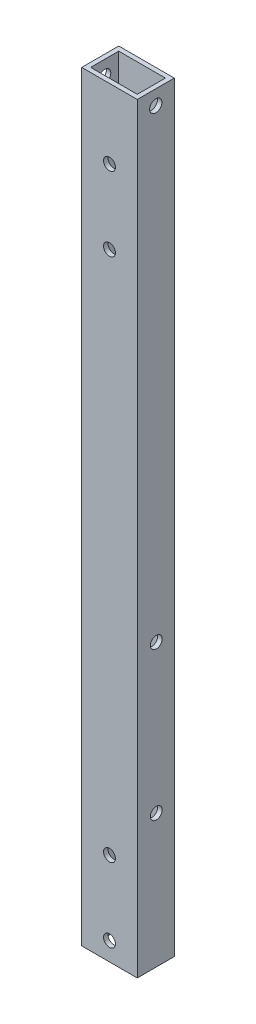
ISO-10303-21;
HEADER;
FILE_DESCRIPTION(('STEP AP214'),'2;1');
FILE_NAME('part.step','',(''),(''),'','','');
FILE_SCHEMA(('AUTOMOTIVE_DESIGN { 1 0 10303 214 1 1 1 1 }'));
ENDSEC;
DATA;
#1=APPLICATION_CONTEXT('core data for automotive mechanical design processes');
#2=APPLICATION_PROTOCOL_DEFINITION('international standard','automotive_design',2000,#1);
#3=PRODUCT_CONTEXT('',#1,'mechanical');
#4=PRODUCT('Part','Part','',(#3));
#5=PRODUCT_RELATED_PRODUCT_CATEGORY('part','',(#4));
#6=PRODUCT_DEFINITION_FORMATION('','',#4);
#7=PRODUCT_DEFINITION_CONTEXT('part definition',#1,'design');
#8=PRODUCT_DEFINITION('design','',#6,#7);
#9=PRODUCT_DEFINITION_SHAPE('','',#8);
#10=(LENGTH_UNIT() NAMED_UNIT(*) SI_UNIT(.MILLI.,.METRE.));
#11=(NAMED_UNIT(*) PLANE_ANGLE_UNIT() SI_UNIT($,.RADIAN.));
#12=(NAMED_UNIT(*) SI_UNIT($,.STERADIAN.) SOLID_ANGLE_UNIT());
#13=UNCERTAINTY_MEASURE_WITH_UNIT(LENGTH_MEASURE(1.E-05),#10,'distance_accuracy_value','');
#14=(GEOMETRIC_REPRESENTATION_CONTEXT(3) GLOBAL_UNCERTAINTY_ASSIGNED_CONTEXT((#13)) GLOBAL_UNIT_ASSIGNED_CONTEXT((#10,
#11,#12)) REPRESENTATION_CONTEXT('',''));
#15=CARTESIAN_POINT('',(0.,0.,0.));
#16=DIRECTION('',(0.,0.,1.));
#17=DIRECTION('',(1.,0.,0.));
#18=AXIS2_PLACEMENT_3D('',#15,#16,#17);
#19=CARTESIAN_POINT('',(7.5,110.,-5.));
#20=DIRECTION('',(-1.,0.,0.));
#21=DIRECTION('',(0.,0.,1.));
#22=AXIS2_PLACEMENT_3D('',#19,#20,#21);
#23=PLANE('',#22);
#24=CARTESIAN_POINT('',(7.5,91.5,0.));
#25=DIRECTION('',(-1.,0.,0.));
#26=DIRECTION('',(0.,0.,1.));
#27=AXIS2_PLACEMENT_3D('',#24,#25,#26);
#28=CIRCLE('',#27,1.65);
#29=CARTESIAN_POINT('',(7.5,91.5,1.64999999999995));
#30=VERTEX_POINT('',#29);
#31=EDGE_CURVE('E323',#30,#30,#28,.T.);
#32=ORIENTED_EDGE('',*,*,#31,.T.);
#33=EDGE_LOOP('',(#32));
#34=FACE_BOUND('',#33,.T.);
#35=CARTESIAN_POINT('',(7.5,-34.0000000000001,-0.125000000000044));
#36=DIRECTION('',(-1.,0.,0.));
#37=DIRECTION('',(0.,0.,1.));
#38=AXIS2_PLACEMENT_3D('',#35,#36,#37);
#39=CIRCLE('',#38,1.6);
#40=CARTESIAN_POINT('',(7.5,-34.0000000000001,1.47499999999995));
#41=VERTEX_POINT('',#40);
#42=EDGE_CURVE('E186',#41,#41,#39,.T.);
#43=ORIENTED_EDGE('',*,*,#42,.T.);
#44=EDGE_LOOP('',(#43));
#45=FACE_BOUND('',#44,.T.);
#46=CARTESIAN_POINT('',(7.5,-74.,-0.125000000000022));
#47=DIRECTION('',(-1.,0.,0.));
#48=DIRECTION('',(0.,0.,1.));
#49=AXIS2_PLACEMENT_3D('',#46,#47,#48);
#50=CIRCLE('',#49,1.60000000000001);
#51=CARTESIAN_POINT('',(7.5,-74.,1.47499999999999));
#52=VERTEX_POINT('',#51);
#53=EDGE_CURVE('E144',#52,#52,#50,.T.);
#54=ORIENTED_EDGE('',*,*,#53,.T.);
#55=EDGE_LOOP('',(#54));
#56=FACE_BOUND('',#55,.T.);
#57=DIRECTION('',(0.,0.,-1.));
#58=VECTOR('',#57,1.);
#59=CARTESIAN_POINT('',(7.5,95.5,5.));
#60=LINE('',#59,#58);
#61=CARTESIAN_POINT('',(7.5,95.5,5.));
#62=VERTEX_POINT('',#61);
#63=CARTESIAN_POINT('',(7.5,95.5,-5.));
#64=VERTEX_POINT('',#63);
#65=EDGE_CURVE('E102',#62,#64,#60,.T.);
#66=ORIENTED_EDGE('',*,*,#65,.F.);
#67=DIRECTION('',(0.,-1.,0.));
#68=VECTOR('',#67,1.);
#69=CARTESIAN_POINT('',(7.5,110.,5.));
#70=LINE('',#69,#68);
#71=CARTESIAN_POINT('',(7.5,-110.,5.));
#72=VERTEX_POINT('',#71);
#73=EDGE_CURVE('E112',#62,#72,#70,.T.);
#74=ORIENTED_EDGE('',*,*,#73,.T.);
#75=DIRECTION('',(0.,0.,-1.));
#76=VECTOR('',#75,1.);
#77=CARTESIAN_POINT('',(7.5,-110.,-5.));
#78=LINE('',#77,#76);
#79=CARTESIAN_POINT('',(7.5,-110.,-5.));
#80=VERTEX_POINT('',#79);
#81=EDGE_CURVE('E229',#72,#80,#78,.T.);
#82=ORIENTED_EDGE('',*,*,#81,.T.);
#83=DIRECTION('',(0.,-1.,0.));
#84=VECTOR('',#83,1.);
#85=CARTESIAN_POINT('',(7.5,110.,-5.));
#86=LINE('',#85,#84);
#87=EDGE_CURVE('E45',#64,#80,#86,.T.);
#88=ORIENTED_EDGE('',*,*,#87,.F.);
#89=EDGE_LOOP('',(#66,#74,#82,#88));
#90=FACE_BOUND('',#89,.T.);
#91=ADVANCED_FACE('F37',(#34,#45,#56,#90),#23,.F.);
#92=CARTESIAN_POINT('',(-7.5,110.,-5.));
#93=DIRECTION('',(0.,0.,1.));
#94=DIRECTION('',(1.,0.,0.));
#95=AXIS2_PLACEMENT_3D('',#92,#93,#94);
#96=PLANE('',#95);
#97=CARTESIAN_POINT('',(0.,56.66,-5.));
#98=DIRECTION('',(0.,0.,-1.));
#99=DIRECTION('',(-1.,0.,0.));
#100=AXIS2_PLACEMENT_3D('',#97,#98,#99);
#101=CIRCLE('',#100,1.6);
#102=CARTESIAN_POINT('',(-1.6,56.66,-5.));
#103=VERTEX_POINT('',#102);
#104=EDGE_CURVE('E152',#103,#103,#101,.T.);
#105=ORIENTED_EDGE('',*,*,#104,.F.);
#106=EDGE_LOOP('',(#105));
#107=FACE_BOUND('',#106,.T.);
#108=CARTESIAN_POINT('',(0.,76.66,-5.));
#109=DIRECTION('',(0.,0.,-1.));
#110=DIRECTION('',(-1.,0.,0.));
#111=AXIS2_PLACEMENT_3D('',#108,#109,#110);
#112=CIRCLE('',#111,1.6);
#113=CARTESIAN_POINT('',(-1.6,76.66,-5.));
#114=VERTEX_POINT('',#113);
#115=EDGE_CURVE('E332',#114,#114,#112,.T.);
#116=ORIENTED_EDGE('',*,*,#115,.F.);
#117=EDGE_LOOP('',(#116));
#118=FACE_BOUND('',#117,.T.);
#119=CARTESIAN_POINT('',(0.,-105.,-5.));
#120=DIRECTION('',(0.,0.,-1.));
#121=DIRECTION('',(-1.,0.,0.));
#122=AXIS2_PLACEMENT_3D('',#119,#120,#121);
#123=CIRCLE('',#122,1.60000000000001);
#124=CARTESIAN_POINT('',(-1.60000000000001,-105.,-5.));
#125=VERTEX_POINT('',#124);
#126=EDGE_CURVE('E195',#125,#125,#123,.T.);
#127=ORIENTED_EDGE('',*,*,#126,.F.);
#128=EDGE_LOOP('',(#127));
#129=FACE_BOUND('',#128,.T.);
#130=CARTESIAN_POINT('',(0.,-85.,-5.));
#131=DIRECTION('',(0.,0.,-1.));
#132=DIRECTION('',(-1.,0.,0.));
#133=AXIS2_PLACEMENT_3D('',#130,#131,#132);
#134=CIRCLE('',#133,1.6);
#135=CARTESIAN_POINT('',(-1.6,-85.,-5.));
#136=VERTEX_POINT('',#135);
#137=EDGE_CURVE('E134',#136,#136,#134,.T.);
#138=ORIENTED_EDGE('',*,*,#137,.F.);
#139=EDGE_LOOP('',(#138));
#140=FACE_BOUND('',#139,.T.);
#141=DIRECTION('',(-1.,0.,0.));
#142=VECTOR('',#141,1.);
#143=CARTESIAN_POINT('',(7.5,95.5,-5.));
#144=LINE('',#143,#142);
#145=CARTESIAN_POINT('',(-7.5,95.5,-5.));
#146=VERTEX_POINT('',#145);
#147=EDGE_CURVE('E114',#64,#146,#144,.T.);
#148=ORIENTED_EDGE('',*,*,#147,.F.);
#149=ORIENTED_EDGE('',*,*,#87,.T.);
#150=DIRECTION('',(-1.,0.,0.));
#151=VECTOR('',#150,1.);
#152=CARTESIAN_POINT('',(-7.5,-110.,-5.));
#153=LINE('',#152,#151);
#154=CARTESIAN_POINT('',(-7.5,-110.,-5.));
#155=VERTEX_POINT('',#154);
#156=EDGE_CURVE('E231',#80,#155,#153,.T.);
#157=ORIENTED_EDGE('',*,*,#156,.T.);
#158=DIRECTION('',(0.,-1.,0.));
#159=VECTOR('',#158,1.);
#160=CARTESIAN_POINT('',(-7.5,110.,-5.));
#161=LINE('',#160,#159);
#162=EDGE_CURVE('E122',#146,#155,#161,.T.);
#163=ORIENTED_EDGE('',*,*,#162,.F.);
#164=EDGE_LOOP('',(#148,#149,#157,#163));
#165=FACE_BOUND('',#164,.T.);
#166=ADVANCED_FACE('F243',(#107,#118,#129,#140,#165),#96,.F.);
#167=CARTESIAN_POINT('',(-7.5,110.,-5.));
#168=DIRECTION('',(1.,0.,0.));
#169=DIRECTION('',(0.,0.,-1.));
#170=AXIS2_PLACEMENT_3D('',#167,#168,#169);
#171=PLANE('',#170);
#172=CARTESIAN_POINT('',(-7.5,91.5,0.));
#173=DIRECTION('',(-1.,0.,0.));
#174=DIRECTION('',(0.,0.,1.));
#175=AXIS2_PLACEMENT_3D('',#172,#173,#174);
#176=CIRCLE('',#175,1.65);
#177=CARTESIAN_POINT('',(-7.5,91.5,1.64999999999995));
#178=VERTEX_POINT('',#177);
#179=EDGE_CURVE('E324',#178,#178,#176,.T.);
#180=ORIENTED_EDGE('',*,*,#179,.F.);
#181=EDGE_LOOP('',(#180));
#182=FACE_BOUND('',#181,.T.);
#183=CARTESIAN_POINT('',(-7.5,-34.0000000000001,-0.125000000000043));
#184=DIRECTION('',(-1.,0.,0.));
#185=DIRECTION('',(0.,0.,1.));
#186=AXIS2_PLACEMENT_3D('',#183,#184,#185);
#187=CIRCLE('',#186,1.6);
#188=CARTESIAN_POINT('',(-7.5,-34.0000000000001,1.47499999999995));
#189=VERTEX_POINT('',#188);
#190=EDGE_CURVE('E180',#189,#189,#187,.T.);
#191=ORIENTED_EDGE('',*,*,#190,.F.);
#192=EDGE_LOOP('',(#191));
#193=FACE_BOUND('',#192,.T.);
#194=CARTESIAN_POINT('',(-7.5,-74.,-0.12500000000002));
#195=DIRECTION('',(-1.,0.,0.));
#196=DIRECTION('',(0.,0.,1.));
#197=AXIS2_PLACEMENT_3D('',#194,#195,#196);
#198=CIRCLE('',#197,1.60000000000001);
#199=CARTESIAN_POINT('',(-7.5,-74.,1.47499999999999));
#200=VERTEX_POINT('',#199);
#201=EDGE_CURVE('E183',#200,#200,#198,.T.);
#202=ORIENTED_EDGE('',*,*,#201,.F.);
#203=EDGE_LOOP('',(#202));
#204=FACE_BOUND('',#203,.T.);
#205=DIRECTION('',(0.,0.,1.));
#206=VECTOR('',#205,1.);
#207=CARTESIAN_POINT('',(-7.5,95.5,-5.));
#208=LINE('',#207,#206);
#209=CARTESIAN_POINT('',(-7.5,95.5,5.));
#210=VERTEX_POINT('',#209);
#211=EDGE_CURVE('E53',#146,#210,#208,.T.);
#212=ORIENTED_EDGE('',*,*,#211,.F.);
#213=ORIENTED_EDGE('',*,*,#162,.T.);
#214=DIRECTION('',(0.,0.,1.));
#215=VECTOR('',#214,1.);
#216=CARTESIAN_POINT('',(-7.5,-110.,-5.));
#217=LINE('',#216,#215);
#218=CARTESIAN_POINT('',(-7.5,-110.,5.));
#219=VERTEX_POINT('',#218);
#220=EDGE_CURVE('E124',#155,#219,#217,.T.);
#221=ORIENTED_EDGE('',*,*,#220,.T.);
#222=DIRECTION('',(0.,-1.,0.));
#223=VECTOR('',#222,1.);
#224=CARTESIAN_POINT('',(-7.5,110.,5.));
#225=LINE('',#224,#223);
#226=EDGE_CURVE('E120',#210,#219,#225,.T.);
#227=ORIENTED_EDGE('',*,*,#226,.F.);
#228=EDGE_LOOP('',(#212,#213,#221,#227));
#229=FACE_BOUND('',#228,.T.);
#230=ADVANCED_FACE('F236',(#182,#193,#204,#229),#171,.F.);
#231=CARTESIAN_POINT('',(-7.5,110.,5.));
#232=DIRECTION('',(0.,0.,-1.));
#233=DIRECTION('',(-1.,0.,0.));
#234=AXIS2_PLACEMENT_3D('',#231,#232,#233);
#235=PLANE('',#234);
#236=CARTESIAN_POINT('',(0.,56.66,5.));
#237=DIRECTION('',(0.,0.,-1.));
#238=DIRECTION('',(-1.,0.,0.));
#239=AXIS2_PLACEMENT_3D('',#236,#237,#238);
#240=CIRCLE('',#239,1.6);
#241=CARTESIAN_POINT('',(-1.6,56.66,5.));
#242=VERTEX_POINT('',#241);
#243=EDGE_CURVE('E107',#242,#242,#240,.T.);
#244=ORIENTED_EDGE('',*,*,#243,.T.);
#245=EDGE_LOOP('',(#244));
#246=FACE_BOUND('',#245,.T.);
#247=CARTESIAN_POINT('',(0.,76.66,5.));
#248=DIRECTION('',(0.,0.,-1.));
#249=DIRECTION('',(-1.,0.,0.));
#250=AXIS2_PLACEMENT_3D('',#247,#248,#249);
#251=CIRCLE('',#250,1.6);
#252=CARTESIAN_POINT('',(-1.6,76.66,5.));
#253=VERTEX_POINT('',#252);
#254=EDGE_CURVE('E156',#253,#253,#251,.T.);
#255=ORIENTED_EDGE('',*,*,#254,.T.);
#256=EDGE_LOOP('',(#255));
#257=FACE_BOUND('',#256,.T.);
#258=CARTESIAN_POINT('',(0.,-105.,5.));
#259=DIRECTION('',(0.,0.,-1.));
#260=DIRECTION('',(-1.,0.,0.));
#261=AXIS2_PLACEMENT_3D('',#258,#259,#260);
#262=CIRCLE('',#261,1.60000000000001);
#263=CARTESIAN_POINT('',(-1.60000000000001,-105.,5.));
#264=VERTEX_POINT('',#263);
#265=EDGE_CURVE('E139',#264,#264,#262,.T.);
#266=ORIENTED_EDGE('',*,*,#265,.T.);
#267=EDGE_LOOP('',(#266));
#268=FACE_BOUND('',#267,.T.);
#269=CARTESIAN_POINT('',(0.,-85.,5.));
#270=DIRECTION('',(0.,0.,-1.));
#271=DIRECTION('',(-1.,0.,0.));
#272=AXIS2_PLACEMENT_3D('',#269,#270,#271);
#273=CIRCLE('',#272,1.6);
#274=CARTESIAN_POINT('',(-1.6,-85.,5.));
#275=VERTEX_POINT('',#274);
#276=EDGE_CURVE('E206',#275,#275,#273,.T.);
#277=ORIENTED_EDGE('',*,*,#276,.T.);
#278=EDGE_LOOP('',(#277));
#279=FACE_BOUND('',#278,.T.);
#280=DIRECTION('',(1.,0.,0.));
#281=VECTOR('',#280,1.);
#282=CARTESIAN_POINT('',(-7.5,95.5,5.));
#283=LINE('',#282,#281);
#284=EDGE_CURVE('E99',#210,#62,#283,.T.);
#285=ORIENTED_EDGE('',*,*,#284,.F.);
#286=ORIENTED_EDGE('',*,*,#226,.T.);
#287=DIRECTION('',(1.,0.,0.));
#288=VECTOR('',#287,1.);
#289=CARTESIAN_POINT('',(-7.5,-110.,5.));
#290=LINE('',#289,#288);
#291=EDGE_CURVE('E118',#219,#72,#290,.T.);
#292=ORIENTED_EDGE('',*,*,#291,.T.);
#293=ORIENTED_EDGE('',*,*,#73,.F.);
#294=EDGE_LOOP('',(#285,#286,#292,#293));
#295=FACE_BOUND('',#294,.T.);
#296=ADVANCED_FACE('F116',(#246,#257,#268,#279,#295),#235,.F.);
#297=CARTESIAN_POINT('',(-6.3,110.,-3.8));
#298=DIRECTION('',(1.,0.,0.));
#299=DIRECTION('',(0.,0.,-1.));
#300=AXIS2_PLACEMENT_3D('',#297,#298,#299);
#301=PLANE('',#300);
#302=CARTESIAN_POINT('',(-6.3,91.5,0.));
#303=DIRECTION('',(1.,0.,0.));
#304=DIRECTION('',(0.,0.,-1.));
#305=AXIS2_PLACEMENT_3D('',#302,#303,#304);
#306=CIRCLE('',#305,1.65);
#307=CARTESIAN_POINT('',(-6.3,91.5,-1.65000000000005));
#308=VERTEX_POINT('',#307);
#309=EDGE_CURVE('E326',#308,#308,#306,.T.);
#310=ORIENTED_EDGE('',*,*,#309,.F.);
#311=EDGE_LOOP('',(#310));
#312=FACE_BOUND('',#311,.T.);
#313=CARTESIAN_POINT('',(-6.3,-74.,-0.12500000000002));
#314=DIRECTION('',(1.,0.,0.));
#315=DIRECTION('',(0.,0.,-1.));
#316=AXIS2_PLACEMENT_3D('',#313,#314,#315);
#317=CIRCLE('',#316,1.60000000000001);
#318=CARTESIAN_POINT('',(-6.3,-74.,-1.72500000000003));
#319=VERTEX_POINT('',#318);
#320=EDGE_CURVE('E147',#319,#319,#317,.T.);
#321=ORIENTED_EDGE('',*,*,#320,.F.);
#322=EDGE_LOOP('',(#321));
#323=FACE_BOUND('',#322,.T.);
#324=CARTESIAN_POINT('',(-6.3,-34.0000000000001,-0.125000000000043));
#325=DIRECTION('',(1.,0.,0.));
#326=DIRECTION('',(0.,0.,-1.));
#327=AXIS2_PLACEMENT_3D('',#324,#325,#326);
#328=CIRCLE('',#327,1.6);
#329=CARTESIAN_POINT('',(-6.3,-34.0000000000001,-1.72500000000004));
#330=VERTEX_POINT('',#329);
#331=EDGE_CURVE('E143',#330,#330,#328,.T.);
#332=ORIENTED_EDGE('',*,*,#331,.F.);
#333=EDGE_LOOP('',(#332));
#334=FACE_BOUND('',#333,.T.);
#335=DIRECTION('',(0.,-1.,0.));
#336=VECTOR('',#335,1.);
#337=CARTESIAN_POINT('',(-6.3,110.,-3.8));
#338=LINE('',#337,#336);
#339=CARTESIAN_POINT('',(-6.3,95.5,-3.8));
#340=VERTEX_POINT('',#339);
#341=CARTESIAN_POINT('',(-6.3,-110.,-3.8));
#342=VERTEX_POINT('',#341);
#343=EDGE_CURVE('E221',#340,#342,#338,.T.);
#344=ORIENTED_EDGE('',*,*,#343,.F.);
#345=DIRECTION('',(0.,0.,1.));
#346=VECTOR('',#345,1.);
#347=CARTESIAN_POINT('',(-6.3,95.5,-3.8));
#348=LINE('',#347,#346);
#349=CARTESIAN_POINT('',(-6.3,95.5,3.8));
#350=VERTEX_POINT('',#349);
#351=EDGE_CURVE('E61',#340,#350,#348,.T.);
#352=ORIENTED_EDGE('',*,*,#351,.T.);
#353=DIRECTION('',(0.,-1.,0.));
#354=VECTOR('',#353,1.);
#355=CARTESIAN_POINT('',(-6.3,110.,3.8));
#356=LINE('',#355,#354);
#357=CARTESIAN_POINT('',(-6.3,-110.,3.8));
#358=VERTEX_POINT('',#357);
#359=EDGE_CURVE('E227',#350,#358,#356,.T.);
#360=ORIENTED_EDGE('',*,*,#359,.T.);
#361=DIRECTION('',(0.,0.,1.));
#362=VECTOR('',#361,1.);
#363=CARTESIAN_POINT('',(-6.3,-110.,-3.8));
#364=LINE('',#363,#362);
#365=EDGE_CURVE('E209',#342,#358,#364,.T.);
#366=ORIENTED_EDGE('',*,*,#365,.F.);
#367=EDGE_LOOP('',(#344,#352,#360,#366));
#368=FACE_BOUND('',#367,.T.);
#369=ADVANCED_FACE('F259',(#312,#323,#334,#368),#301,.T.);
#370=CARTESIAN_POINT('',(-6.3,110.,3.8));
#371=DIRECTION('',(0.,0.,-1.));
#372=DIRECTION('',(-1.,0.,0.));
#373=AXIS2_PLACEMENT_3D('',#370,#371,#372);
#374=PLANE('',#373);
#375=CARTESIAN_POINT('',(0.,56.66,3.8));
#376=DIRECTION('',(0.,0.,-1.));
#377=DIRECTION('',(-1.,0.,0.));
#378=AXIS2_PLACEMENT_3D('',#375,#376,#377);
#379=CIRCLE('',#378,1.6);
#380=CARTESIAN_POINT('',(-1.6,56.66,3.8));
#381=VERTEX_POINT('',#380);
#382=EDGE_CURVE('E155',#381,#381,#379,.T.);
#383=ORIENTED_EDGE('',*,*,#382,.F.);
#384=EDGE_LOOP('',(#383));
#385=FACE_BOUND('',#384,.T.);
#386=CARTESIAN_POINT('',(0.,76.66,3.8));
#387=DIRECTION('',(0.,0.,-1.));
#388=DIRECTION('',(-1.,0.,0.));
#389=AXIS2_PLACEMENT_3D('',#386,#387,#388);
#390=CIRCLE('',#389,1.6);
#391=CARTESIAN_POINT('',(-1.6,76.66,3.8));
#392=VERTEX_POINT('',#391);
#393=EDGE_CURVE('E151',#392,#392,#390,.T.);
#394=ORIENTED_EDGE('',*,*,#393,.F.);
#395=EDGE_LOOP('',(#394));
#396=FACE_BOUND('',#395,.T.);
#397=CARTESIAN_POINT('',(0.,-85.,3.8));
#398=DIRECTION('',(0.,0.,-1.));
#399=DIRECTION('',(-1.,0.,0.));
#400=AXIS2_PLACEMENT_3D('',#397,#398,#399);
#401=CIRCLE('',#400,1.6);
#402=CARTESIAN_POINT('',(-1.6,-85.,3.8));
#403=VERTEX_POINT('',#402);
#404=EDGE_CURVE('E138',#403,#403,#401,.T.);
#405=ORIENTED_EDGE('',*,*,#404,.F.);
#406=EDGE_LOOP('',(#405));
#407=FACE_BOUND('',#406,.T.);
#408=CARTESIAN_POINT('',(0.,-105.,3.8));
#409=DIRECTION('',(0.,0.,-1.));
#410=DIRECTION('',(-1.,0.,0.));
#411=AXIS2_PLACEMENT_3D('',#408,#409,#410);
#412=CIRCLE('',#411,1.60000000000001);
#413=CARTESIAN_POINT('',(-1.60000000000001,-105.,3.8));
#414=VERTEX_POINT('',#413);
#415=EDGE_CURVE('E133',#414,#414,#412,.T.);
#416=ORIENTED_EDGE('',*,*,#415,.F.);
#417=EDGE_LOOP('',(#416));
#418=FACE_BOUND('',#417,.T.);
#419=ORIENTED_EDGE('',*,*,#359,.F.);
#420=DIRECTION('',(1.,0.,0.));
#421=VECTOR('',#420,1.);
#422=CARTESIAN_POINT('',(-6.3,95.5,3.8));
#423=LINE('',#422,#421);
#424=CARTESIAN_POINT('',(6.3,95.5,3.8));
#425=VERTEX_POINT('',#424);
#426=EDGE_CURVE('E176',#350,#425,#423,.T.);
#427=ORIENTED_EDGE('',*,*,#426,.T.);
#428=DIRECTION('',(0.,-1.,0.));
#429=VECTOR('',#428,1.);
#430=CARTESIAN_POINT('',(6.3,110.,3.8));
#431=LINE('',#430,#429);
#432=CARTESIAN_POINT('',(6.3,-110.,3.8));
#433=VERTEX_POINT('',#432);
#434=EDGE_CURVE('E225',#425,#433,#431,.T.);
#435=ORIENTED_EDGE('',*,*,#434,.T.);
#436=DIRECTION('',(1.,0.,0.));
#437=VECTOR('',#436,1.);
#438=CARTESIAN_POINT('',(-6.3,-110.,3.8));
#439=LINE('',#438,#437);
#440=EDGE_CURVE('E212',#358,#433,#439,.T.);
#441=ORIENTED_EDGE('',*,*,#440,.F.);
#442=EDGE_LOOP('',(#419,#427,#435,#441));
#443=FACE_BOUND('',#442,.T.);
#444=ADVANCED_FACE('F267',(#385,#396,#407,#418,#443),#374,.T.);
#445=CARTESIAN_POINT('',(6.3,110.,-3.8));
#446=DIRECTION('',(-1.,0.,0.));
#447=DIRECTION('',(0.,0.,1.));
#448=AXIS2_PLACEMENT_3D('',#445,#446,#447);
#449=PLANE('',#448);
#450=CARTESIAN_POINT('',(6.3,91.5,0.));
#451=DIRECTION('',(-1.,0.,0.));
#452=DIRECTION('',(0.,0.,1.));
#453=AXIS2_PLACEMENT_3D('',#450,#451,#452);
#454=CIRCLE('',#453,1.65);
#455=CARTESIAN_POINT('',(6.3,91.5,1.64999999999995));
#456=VERTEX_POINT('',#455);
#457=EDGE_CURVE('E40',#456,#456,#454,.T.);
#458=ORIENTED_EDGE('',*,*,#457,.F.);
#459=EDGE_LOOP('',(#458));
#460=FACE_BOUND('',#459,.T.);
#461=CARTESIAN_POINT('',(6.3,-74.,-0.125000000000022));
#462=DIRECTION('',(-1.,0.,0.));
#463=DIRECTION('',(0.,0.,1.));
#464=AXIS2_PLACEMENT_3D('',#461,#462,#463);
#465=CIRCLE('',#464,1.60000000000001);
#466=CARTESIAN_POINT('',(6.3,-74.,1.47499999999999));
#467=VERTEX_POINT('',#466);
#468=EDGE_CURVE('E145',#467,#467,#465,.T.);
#469=ORIENTED_EDGE('',*,*,#468,.F.);
#470=EDGE_LOOP('',(#469));
#471=FACE_BOUND('',#470,.T.);
#472=CARTESIAN_POINT('',(6.3,-34.0000000000001,-0.125000000000044));
#473=DIRECTION('',(-1.,0.,0.));
#474=DIRECTION('',(0.,0.,1.));
#475=AXIS2_PLACEMENT_3D('',#472,#473,#474);
#476=CIRCLE('',#475,1.6);
#477=CARTESIAN_POINT('',(6.3,-34.0000000000001,1.47499999999995));
#478=VERTEX_POINT('',#477);
#479=EDGE_CURVE('E140',#478,#478,#476,.T.);
#480=ORIENTED_EDGE('',*,*,#479,.F.);
#481=EDGE_LOOP('',(#480));
#482=FACE_BOUND('',#481,.T.);
#483=ORIENTED_EDGE('',*,*,#434,.F.);
#484=DIRECTION('',(0.,0.,-1.));
#485=VECTOR('',#484,1.);
#486=CARTESIAN_POINT('',(6.3,95.5,-3.8));
#487=LINE('',#486,#485);
#488=CARTESIAN_POINT('',(6.3,95.5,-3.8));
#489=VERTEX_POINT('',#488);
#490=EDGE_CURVE('E173',#425,#489,#487,.T.);
#491=ORIENTED_EDGE('',*,*,#490,.T.);
#492=DIRECTION('',(0.,-1.,0.));
#493=VECTOR('',#492,1.);
#494=CARTESIAN_POINT('',(6.3,110.,-3.8));
#495=LINE('',#494,#493);
#496=CARTESIAN_POINT('',(6.3,-110.,-3.8));
#497=VERTEX_POINT('',#496);
#498=EDGE_CURVE('E223',#489,#497,#495,.T.);
#499=ORIENTED_EDGE('',*,*,#498,.T.);
#500=DIRECTION('',(0.,0.,-1.));
#501=VECTOR('',#500,1.);
#502=CARTESIAN_POINT('',(6.3,-110.,-3.8));
#503=LINE('',#502,#501);
#504=EDGE_CURVE('E215',#433,#497,#503,.T.);
#505=ORIENTED_EDGE('',*,*,#504,.F.);
#506=EDGE_LOOP('',(#483,#491,#499,#505));
#507=FACE_BOUND('',#506,.T.);
#508=ADVANCED_FACE('F271',(#460,#471,#482,#507),#449,.T.);
#509=CARTESIAN_POINT('',(-6.3,110.,-3.8));
#510=DIRECTION('',(0.,0.,1.));
#511=DIRECTION('',(1.,0.,0.));
#512=AXIS2_PLACEMENT_3D('',#509,#510,#511);
#513=PLANE('',#512);
#514=CARTESIAN_POINT('',(0.,56.66,-3.8));
#515=DIRECTION('',(0.,0.,1.));
#516=DIRECTION('',(1.,0.,0.));
#517=AXIS2_PLACEMENT_3D('',#514,#515,#516);
#518=CIRCLE('',#517,1.6);
#519=CARTESIAN_POINT('',(1.6,56.66,-3.8));
#520=VERTEX_POINT('',#519);
#521=EDGE_CURVE('E153',#520,#520,#518,.T.);
#522=ORIENTED_EDGE('',*,*,#521,.F.);
#523=EDGE_LOOP('',(#522));
#524=FACE_BOUND('',#523,.T.);
#525=CARTESIAN_POINT('',(0.,76.66,-3.8));
#526=DIRECTION('',(0.,0.,1.));
#527=DIRECTION('',(1.,0.,0.));
#528=AXIS2_PLACEMENT_3D('',#525,#526,#527);
#529=CIRCLE('',#528,1.6);
#530=CARTESIAN_POINT('',(1.6,76.66,-3.8));
#531=VERTEX_POINT('',#530);
#532=EDGE_CURVE('E149',#531,#531,#529,.T.);
#533=ORIENTED_EDGE('',*,*,#532,.F.);
#534=EDGE_LOOP('',(#533));
#535=FACE_BOUND('',#534,.T.);
#536=CARTESIAN_POINT('',(0.,-85.,-3.8));
#537=DIRECTION('',(0.,0.,1.));
#538=DIRECTION('',(1.,0.,0.));
#539=AXIS2_PLACEMENT_3D('',#536,#537,#538);
#540=CIRCLE('',#539,1.6);
#541=CARTESIAN_POINT('',(1.6,-85.,-3.8));
#542=VERTEX_POINT('',#541);
#543=EDGE_CURVE('E135',#542,#542,#540,.T.);
#544=ORIENTED_EDGE('',*,*,#543,.F.);
#545=EDGE_LOOP('',(#544));
#546=FACE_BOUND('',#545,.T.);
#547=CARTESIAN_POINT('',(0.,-105.,-3.8));
#548=DIRECTION('',(0.,0.,1.));
#549=DIRECTION('',(1.,0.,0.));
#550=AXIS2_PLACEMENT_3D('',#547,#548,#549);
#551=CIRCLE('',#550,1.60000000000001);
#552=CARTESIAN_POINT('',(1.60000000000001,-105.,-3.8));
#553=VERTEX_POINT('',#552);
#554=EDGE_CURVE('E130',#553,#553,#551,.T.);
#555=ORIENTED_EDGE('',*,*,#554,.F.);
#556=EDGE_LOOP('',(#555));
#557=FACE_BOUND('',#556,.T.);
#558=ORIENTED_EDGE('',*,*,#498,.F.);
#559=DIRECTION('',(-1.,0.,0.));
#560=VECTOR('',#559,1.);
#561=CARTESIAN_POINT('',(-6.3,95.5,-3.8));
#562=LINE('',#561,#560);
#563=EDGE_CURVE('E11',#489,#340,#562,.T.);
#564=ORIENTED_EDGE('',*,*,#563,.T.);
#565=ORIENTED_EDGE('',*,*,#343,.T.);
#566=DIRECTION('',(-1.,0.,0.));
#567=VECTOR('',#566,1.);
#568=CARTESIAN_POINT('',(-6.3,-110.,-3.8));
#569=LINE('',#568,#567);
#570=EDGE_CURVE('E218',#497,#342,#569,.T.);
#571=ORIENTED_EDGE('',*,*,#570,.F.);
#572=EDGE_LOOP('',(#558,#564,#565,#571));
#573=FACE_BOUND('',#572,.T.);
#574=ADVANCED_FACE('F264',(#524,#535,#546,#557,#573),#513,.T.);
#575=CARTESIAN_POINT('',(0.,-110.,0.));
#576=DIRECTION('',(0.,1.,0.));
#577=DIRECTION('',(0.,0.,1.));
#578=AXIS2_PLACEMENT_3D('',#575,#576,#577);
#579=PLANE('',#578);
#580=ORIENTED_EDGE('',*,*,#81,.F.);
#581=ORIENTED_EDGE('',*,*,#291,.F.);
#582=ORIENTED_EDGE('',*,*,#220,.F.);
#583=ORIENTED_EDGE('',*,*,#156,.F.);
#584=EDGE_LOOP('',(#580,#581,#582,#583));
#585=FACE_BOUND('',#584,.T.);
#586=ORIENTED_EDGE('',*,*,#365,.T.);
#587=ORIENTED_EDGE('',*,*,#440,.T.);
#588=ORIENTED_EDGE('',*,*,#504,.T.);
#589=ORIENTED_EDGE('',*,*,#570,.T.);
#590=EDGE_LOOP('',(#586,#587,#588,#589));
#591=FACE_BOUND('',#590,.T.);
#592=ADVANCED_FACE('F240',(#585,#591),#579,.F.);
#593=CARTESIAN_POINT('',(0.,-105.,95.));
#594=DIRECTION('',(0.,0.,-1.));
#595=DIRECTION('',(-1.,0.,0.));
#596=AXIS2_PLACEMENT_3D('',#593,#594,#595);
#597=CYLINDRICAL_SURFACE('',#596,1.60000000000001);
#598=ORIENTED_EDGE('',*,*,#554,.T.);
#599=EDGE_LOOP('',(#598));
#600=FACE_BOUND('',#599,.T.);
#601=ORIENTED_EDGE('',*,*,#126,.T.);
#602=EDGE_LOOP('',(#601));
#603=FACE_BOUND('',#602,.T.);
#604=ADVANCED_FACE('F263',(#600,#603),#597,.F.);
#605=CARTESIAN_POINT('',(0.,-85.,95.));
#606=DIRECTION('',(0.,0.,-1.));
#607=DIRECTION('',(-1.,0.,0.));
#608=AXIS2_PLACEMENT_3D('',#605,#606,#607);
#609=CYLINDRICAL_SURFACE('',#608,1.6);
#610=ORIENTED_EDGE('',*,*,#543,.T.);
#611=EDGE_LOOP('',(#610));
#612=FACE_BOUND('',#611,.T.);
#613=ORIENTED_EDGE('',*,*,#137,.T.);
#614=EDGE_LOOP('',(#613));
#615=FACE_BOUND('',#614,.T.);
#616=ADVANCED_FACE('F281',(#612,#615),#609,.F.);
#617=ORIENTED_EDGE('',*,*,#415,.T.);
#618=EDGE_LOOP('',(#617));
#619=FACE_BOUND('',#618,.T.);
#620=ORIENTED_EDGE('',*,*,#265,.F.);
#621=EDGE_LOOP('',(#620));
#622=FACE_BOUND('',#621,.T.);
#623=ADVANCED_FACE('F283',(#619,#622),#597,.F.);
#624=ORIENTED_EDGE('',*,*,#404,.T.);
#625=EDGE_LOOP('',(#624));
#626=FACE_BOUND('',#625,.T.);
#627=ORIENTED_EDGE('',*,*,#276,.F.);
#628=EDGE_LOOP('',(#627));
#629=FACE_BOUND('',#628,.T.);
#630=ADVANCED_FACE('F287',(#626,#629),#609,.F.);
#631=CARTESIAN_POINT('',(7.5,-34.0000000000001,-0.125000000000044));
#632=DIRECTION('',(-1.,0.,0.));
#633=DIRECTION('',(0.,0.,1.));
#634=AXIS2_PLACEMENT_3D('',#631,#632,#633);
#635=CYLINDRICAL_SURFACE('',#634,1.6);
#636=ORIENTED_EDGE('',*,*,#479,.T.);
#637=EDGE_LOOP('',(#636));
#638=FACE_BOUND('',#637,.T.);
#639=ORIENTED_EDGE('',*,*,#42,.F.);
#640=EDGE_LOOP('',(#639));
#641=FACE_BOUND('',#640,.T.);
#642=ADVANCED_FACE('F288',(#638,#641),#635,.F.);
#643=CARTESIAN_POINT('',(7.5,-74.,-0.125000000000022));
#644=DIRECTION('',(-1.,0.,0.));
#645=DIRECTION('',(0.,0.,1.));
#646=AXIS2_PLACEMENT_3D('',#643,#644,#645);
#647=CYLINDRICAL_SURFACE('',#646,1.60000000000001);
#648=ORIENTED_EDGE('',*,*,#468,.T.);
#649=EDGE_LOOP('',(#648));
#650=FACE_BOUND('',#649,.T.);
#651=ORIENTED_EDGE('',*,*,#53,.F.);
#652=EDGE_LOOP('',(#651));
#653=FACE_BOUND('',#652,.T.);
#654=ADVANCED_FACE('F291',(#650,#653),#647,.F.);
#655=ORIENTED_EDGE('',*,*,#331,.T.);
#656=EDGE_LOOP('',(#655));
#657=FACE_BOUND('',#656,.T.);
#658=ORIENTED_EDGE('',*,*,#190,.T.);
#659=EDGE_LOOP('',(#658));
#660=FACE_BOUND('',#659,.T.);
#661=ADVANCED_FACE('F293',(#657,#660),#635,.F.);
#662=ORIENTED_EDGE('',*,*,#320,.T.);
#663=EDGE_LOOP('',(#662));
#664=FACE_BOUND('',#663,.T.);
#665=ORIENTED_EDGE('',*,*,#201,.T.);
#666=EDGE_LOOP('',(#665));
#667=FACE_BOUND('',#666,.T.);
#668=ADVANCED_FACE('F297',(#664,#667),#647,.F.);
#669=CARTESIAN_POINT('',(0.,95.5,0.));
#670=DIRECTION('',(0.,1.,0.));
#671=DIRECTION('',(0.,0.,1.));
#672=AXIS2_PLACEMENT_3D('',#669,#670,#671);
#673=PLANE('',#672);
#674=ORIENTED_EDGE('',*,*,#563,.F.);
#675=ORIENTED_EDGE('',*,*,#490,.F.);
#676=ORIENTED_EDGE('',*,*,#426,.F.);
#677=ORIENTED_EDGE('',*,*,#351,.F.);
#678=EDGE_LOOP('',(#674,#675,#676,#677));
#679=FACE_BOUND('',#678,.T.);
#680=ORIENTED_EDGE('',*,*,#284,.T.);
#681=ORIENTED_EDGE('',*,*,#65,.T.);
#682=ORIENTED_EDGE('',*,*,#147,.T.);
#683=ORIENTED_EDGE('',*,*,#211,.T.);
#684=EDGE_LOOP('',(#680,#681,#682,#683));
#685=FACE_BOUND('',#684,.T.);
#686=ADVANCED_FACE('F101',(#679,#685),#673,.T.);
#687=CARTESIAN_POINT('',(0.,76.66,10.));
#688=DIRECTION('',(0.,0.,-1.));
#689=DIRECTION('',(-1.,0.,0.));
#690=AXIS2_PLACEMENT_3D('',#687,#688,#689);
#691=CYLINDRICAL_SURFACE('',#690,1.6);
#692=ORIENTED_EDGE('',*,*,#532,.T.);
#693=EDGE_LOOP('',(#692));
#694=FACE_BOUND('',#693,.T.);
#695=ORIENTED_EDGE('',*,*,#115,.T.);
#696=EDGE_LOOP('',(#695));
#697=FACE_BOUND('',#696,.T.);
#698=ADVANCED_FACE('F299',(#694,#697),#691,.F.);
#699=CARTESIAN_POINT('',(0.,56.66,10.));
#700=DIRECTION('',(0.,0.,-1.));
#701=DIRECTION('',(-1.,0.,0.));
#702=AXIS2_PLACEMENT_3D('',#699,#700,#701);
#703=CYLINDRICAL_SURFACE('',#702,1.6);
#704=ORIENTED_EDGE('',*,*,#521,.T.);
#705=EDGE_LOOP('',(#704));
#706=FACE_BOUND('',#705,.T.);
#707=ORIENTED_EDGE('',*,*,#104,.T.);
#708=EDGE_LOOP('',(#707));
#709=FACE_BOUND('',#708,.T.);
#710=ADVANCED_FACE('F302',(#706,#709),#703,.F.);
#711=ORIENTED_EDGE('',*,*,#393,.T.);
#712=EDGE_LOOP('',(#711));
#713=FACE_BOUND('',#712,.T.);
#714=ORIENTED_EDGE('',*,*,#254,.F.);
#715=EDGE_LOOP('',(#714));
#716=FACE_BOUND('',#715,.T.);
#717=ADVANCED_FACE('F304',(#713,#716),#691,.F.);
#718=ORIENTED_EDGE('',*,*,#382,.T.);
#719=EDGE_LOOP('',(#718));
#720=FACE_BOUND('',#719,.T.);
#721=ORIENTED_EDGE('',*,*,#243,.F.);
#722=EDGE_LOOP('',(#721));
#723=FACE_BOUND('',#722,.T.);
#724=ADVANCED_FACE('F307',(#720,#723),#703,.F.);
#725=CARTESIAN_POINT('',(7.5,91.5,0.));
#726=DIRECTION('',(-1.,0.,0.));
#727=DIRECTION('',(0.,0.,1.));
#728=AXIS2_PLACEMENT_3D('',#725,#726,#727);
#729=CYLINDRICAL_SURFACE('',#728,1.65);
#730=ORIENTED_EDGE('',*,*,#457,.T.);
#731=EDGE_LOOP('',(#730));
#732=FACE_BOUND('',#731,.T.);
#733=ORIENTED_EDGE('',*,*,#31,.F.);
#734=EDGE_LOOP('',(#733));
#735=FACE_BOUND('',#734,.T.);
#736=ADVANCED_FACE('F308',(#732,#735),#729,.F.);
#737=ORIENTED_EDGE('',*,*,#309,.T.);
#738=EDGE_LOOP('',(#737));
#739=FACE_BOUND('',#738,.T.);
#740=ORIENTED_EDGE('',*,*,#179,.T.);
#741=EDGE_LOOP('',(#740));
#742=FACE_BOUND('',#741,.T.);
#743=ADVANCED_FACE('F310',(#739,#742),#729,.F.);
#744=CLOSED_SHELL('',(#91,#166,#230,#296,#369,#444,#508,#574,#592,#604,#616,#623,#630,#642,#654,
#661,#668,#686,#698,#710,#717,#724,#736,#743));
#745=MANIFOLD_SOLID_BREP('B2',#744);
#746=ADVANCED_BREP_SHAPE_REPRESENTATION('',(#18,#745),#14);
#747=SHAPE_DEFINITION_REPRESENTATION(#9,#746);
ENDSEC;
END-ISO-10303-21;
